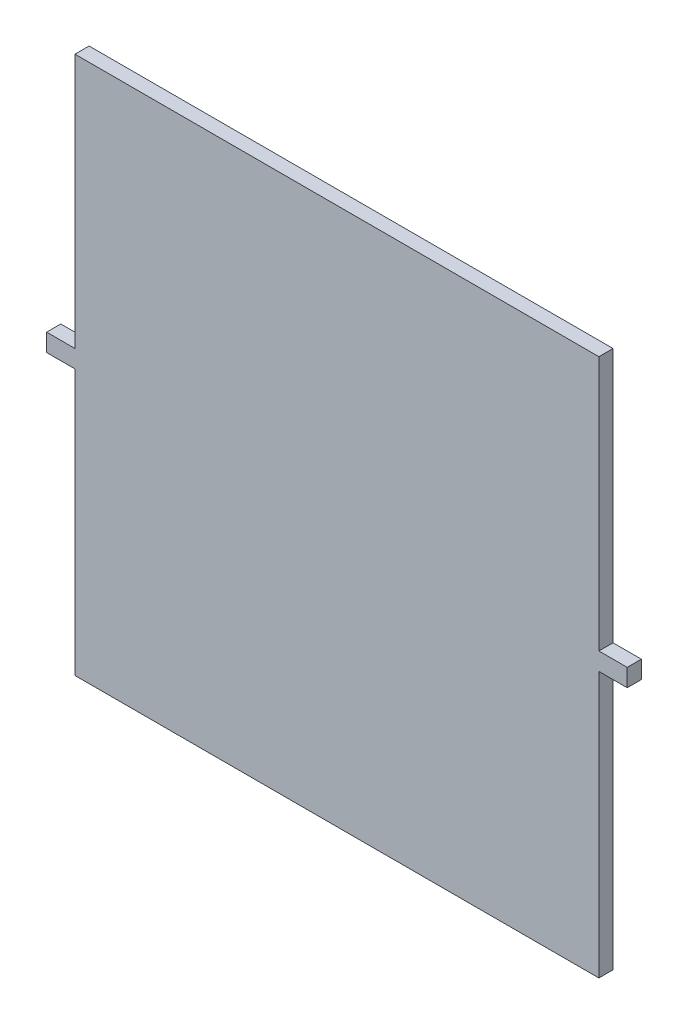
ISO-10303-21;
HEADER;
FILE_DESCRIPTION(('STEP AP214'),'2;1');
FILE_NAME('part.step','',(''),(''),'','','');
FILE_SCHEMA(('AUTOMOTIVE_DESIGN { 1 0 10303 214 1 1 1 1 }'));
ENDSEC;
DATA;
#1=APPLICATION_CONTEXT('core data for automotive mechanical design processes');
#2=APPLICATION_PROTOCOL_DEFINITION('international standard','automotive_design',2000,#1);
#3=PRODUCT_CONTEXT('',#1,'mechanical');
#4=PRODUCT('Part','Part','',(#3));
#5=PRODUCT_RELATED_PRODUCT_CATEGORY('part','',(#4));
#6=PRODUCT_DEFINITION_FORMATION('','',#4);
#7=PRODUCT_DEFINITION_CONTEXT('part definition',#1,'design');
#8=PRODUCT_DEFINITION('design','',#6,#7);
#9=PRODUCT_DEFINITION_SHAPE('','',#8);
#10=(LENGTH_UNIT() NAMED_UNIT(*) SI_UNIT(.MILLI.,.METRE.));
#11=(NAMED_UNIT(*) PLANE_ANGLE_UNIT() SI_UNIT($,.RADIAN.));
#12=(NAMED_UNIT(*) SI_UNIT($,.STERADIAN.) SOLID_ANGLE_UNIT());
#13=UNCERTAINTY_MEASURE_WITH_UNIT(LENGTH_MEASURE(1.E-05),#10,'distance_accuracy_value','');
#14=(GEOMETRIC_REPRESENTATION_CONTEXT(3) GLOBAL_UNCERTAINTY_ASSIGNED_CONTEXT((#13)) GLOBAL_UNIT_ASSIGNED_CONTEXT((#10,
#11,#12)) REPRESENTATION_CONTEXT('',''));
#15=CARTESIAN_POINT('',(0.,0.,0.));
#16=DIRECTION('',(0.,0.,1.));
#17=DIRECTION('',(1.,0.,0.));
#18=AXIS2_PLACEMENT_3D('',#15,#16,#17);
#19=CARTESIAN_POINT('',(0.,0.,4.));
#20=DIRECTION('',(-1.,0.,0.));
#21=DIRECTION('',(0.,0.,1.));
#22=AXIS2_PLACEMENT_3D('',#19,#20,#21);
#23=PLANE('',#22);
#24=DIRECTION('',(0.,1.,0.));
#25=VECTOR('',#24,1.);
#26=CARTESIAN_POINT('',(0.,0.,0.));
#27=LINE('',#26,#25);
#28=CARTESIAN_POINT('',(0.,80.,0.));
#29=VERTEX_POINT('',#28);
#30=CARTESIAN_POINT('',(0.,152.,0.));
#31=VERTEX_POINT('',#30);
#32=EDGE_CURVE('E156',#29,#31,#27,.T.);
#33=ORIENTED_EDGE('',*,*,#32,.F.);
#34=DIRECTION('',(0.,0.,-1.));
#35=VECTOR('',#34,1.);
#36=CARTESIAN_POINT('',(0.,80.,4.));
#37=LINE('',#36,#35);
#38=CARTESIAN_POINT('',(0.,80.,4.));
#39=VERTEX_POINT('',#38);
#40=EDGE_CURVE('E11',#39,#29,#37,.T.);
#41=ORIENTED_EDGE('',*,*,#40,.F.);
#42=DIRECTION('',(0.,1.,0.));
#43=VECTOR('',#42,1.);
#44=CARTESIAN_POINT('',(0.,0.,4.));
#45=LINE('',#44,#43);
#46=CARTESIAN_POINT('',(0.,152.,4.));
#47=VERTEX_POINT('',#46);
#48=EDGE_CURVE('E185',#39,#47,#45,.T.);
#49=ORIENTED_EDGE('',*,*,#48,.T.);
#50=DIRECTION('',(0.,0.,-1.));
#51=VECTOR('',#50,1.);
#52=CARTESIAN_POINT('',(0.,152.,4.));
#53=LINE('',#52,#51);
#54=EDGE_CURVE('E53',#47,#31,#53,.T.);
#55=ORIENTED_EDGE('',*,*,#54,.T.);
#56=EDGE_LOOP('',(#33,#41,#49,#55));
#57=FACE_BOUND('',#56,.T.);
#58=ADVANCED_FACE('F37',(#57),#23,.T.);
#59=CARTESIAN_POINT('',(1.38777878078145E-13,80.,4.));
#60=DIRECTION('',(0.,-1.,0.));
#61=DIRECTION('',(1.,0.,0.));
#62=AXIS2_PLACEMENT_3D('',#59,#60,#61);
#63=PLANE('',#62);
#64=DIRECTION('',(-1.,0.,0.));
#65=VECTOR('',#64,1.);
#66=CARTESIAN_POINT('',(1.38777878078145E-13,80.,0.));
#67=LINE('',#66,#65);
#68=CARTESIAN_POINT('',(-8.,80.,0.));
#69=VERTEX_POINT('',#68);
#70=EDGE_CURVE('E158',#29,#69,#67,.T.);
#71=ORIENTED_EDGE('',*,*,#70,.T.);
#72=DIRECTION('',(0.,0.,-1.));
#73=VECTOR('',#72,1.);
#74=CARTESIAN_POINT('',(-8.,80.,4.));
#75=LINE('',#74,#73);
#76=CARTESIAN_POINT('',(-8.,80.,4.));
#77=VERTEX_POINT('',#76);
#78=EDGE_CURVE('E45',#77,#69,#75,.T.);
#79=ORIENTED_EDGE('',*,*,#78,.F.);
#80=DIRECTION('',(-1.,0.,0.));
#81=VECTOR('',#80,1.);
#82=CARTESIAN_POINT('',(1.38777878078145E-13,80.,4.));
#83=LINE('',#82,#81);
#84=EDGE_CURVE('E228',#39,#77,#83,.T.);
#85=ORIENTED_EDGE('',*,*,#84,.F.);
#86=ORIENTED_EDGE('',*,*,#40,.T.);
#87=EDGE_LOOP('',(#71,#79,#85,#86));
#88=FACE_BOUND('',#87,.T.);
#89=ADVANCED_FACE('F255',(#88),#63,.F.);
#90=CARTESIAN_POINT('',(-8.,0.,4.));
#91=DIRECTION('',(1.,0.,0.));
#92=DIRECTION('',(0.,0.,-1.));
#93=AXIS2_PLACEMENT_3D('',#90,#91,#92);
#94=PLANE('',#93);
#95=DIRECTION('',(0.,-1.,0.));
#96=VECTOR('',#95,1.);
#97=CARTESIAN_POINT('',(-8.,0.,0.));
#98=LINE('',#97,#96);
#99=CARTESIAN_POINT('',(-8.,75.,0.));
#100=VERTEX_POINT('',#99);
#101=EDGE_CURVE('E160',#69,#100,#98,.T.);
#102=ORIENTED_EDGE('',*,*,#101,.T.);
#103=DIRECTION('',(0.,0.,-1.));
#104=VECTOR('',#103,1.);
#105=CARTESIAN_POINT('',(-8.,75.,4.));
#106=LINE('',#105,#104);
#107=CARTESIAN_POINT('',(-8.,75.,4.));
#108=VERTEX_POINT('',#107);
#109=EDGE_CURVE('E201',#108,#100,#106,.T.);
#110=ORIENTED_EDGE('',*,*,#109,.F.);
#111=DIRECTION('',(0.,-1.,0.));
#112=VECTOR('',#111,1.);
#113=CARTESIAN_POINT('',(-8.,0.,4.));
#114=LINE('',#113,#112);
#115=EDGE_CURVE('E209',#77,#108,#114,.T.);
#116=ORIENTED_EDGE('',*,*,#115,.F.);
#117=ORIENTED_EDGE('',*,*,#78,.T.);
#118=EDGE_LOOP('',(#102,#110,#116,#117));
#119=FACE_BOUND('',#118,.T.);
#120=ADVANCED_FACE('F207',(#119),#94,.F.);
#121=CARTESIAN_POINT('',(0.,75.,4.));
#122=DIRECTION('',(0.,-1.,0.));
#123=DIRECTION('',(0.,0.,-1.));
#124=AXIS2_PLACEMENT_3D('',#121,#122,#123);
#125=PLANE('',#124);
#126=DIRECTION('',(-1.,0.,0.));
#127=VECTOR('',#126,1.);
#128=CARTESIAN_POINT('',(0.,75.,0.));
#129=LINE('',#128,#127);
#130=CARTESIAN_POINT('',(0.,75.,0.));
#131=VERTEX_POINT('',#130);
#132=EDGE_CURVE('E163',#131,#100,#129,.T.);
#133=ORIENTED_EDGE('',*,*,#132,.F.);
#134=DIRECTION('',(0.,0.,-1.));
#135=VECTOR('',#134,1.);
#136=CARTESIAN_POINT('',(0.,75.,4.));
#137=LINE('',#136,#135);
#138=CARTESIAN_POINT('',(0.,75.,4.));
#139=VERTEX_POINT('',#138);
#140=EDGE_CURVE('E199',#139,#131,#137,.T.);
#141=ORIENTED_EDGE('',*,*,#140,.F.);
#142=DIRECTION('',(-1.,0.,0.));
#143=VECTOR('',#142,1.);
#144=CARTESIAN_POINT('',(0.,75.,4.));
#145=LINE('',#144,#143);
#146=EDGE_CURVE('E221',#139,#108,#145,.T.);
#147=ORIENTED_EDGE('',*,*,#146,.T.);
#148=ORIENTED_EDGE('',*,*,#109,.T.);
#149=EDGE_LOOP('',(#133,#141,#147,#148));
#150=FACE_BOUND('',#149,.T.);
#151=ADVANCED_FACE('F218',(#150),#125,.T.);
#152=CARTESIAN_POINT('',(0.,0.,4.));
#153=DIRECTION('',(-1.,0.,0.));
#154=DIRECTION('',(0.,0.,1.));
#155=AXIS2_PLACEMENT_3D('',#152,#153,#154);
#156=PLANE('',#155);
#157=DIRECTION('',(0.,1.,0.));
#158=VECTOR('',#157,1.);
#159=CARTESIAN_POINT('',(0.,0.,0.));
#160=LINE('',#159,#158);
#161=CARTESIAN_POINT('',(0.,0.,0.));
#162=VERTEX_POINT('',#161);
#163=EDGE_CURVE('E166',#162,#131,#160,.T.);
#164=ORIENTED_EDGE('',*,*,#163,.F.);
#165=DIRECTION('',(0.,0.,-1.));
#166=VECTOR('',#165,1.);
#167=CARTESIAN_POINT('',(0.,0.,4.));
#168=LINE('',#167,#166);
#169=CARTESIAN_POINT('',(0.,0.,4.));
#170=VERTEX_POINT('',#169);
#171=EDGE_CURVE('E197',#170,#162,#168,.T.);
#172=ORIENTED_EDGE('',*,*,#171,.F.);
#173=DIRECTION('',(0.,1.,0.));
#174=VECTOR('',#173,1.);
#175=CARTESIAN_POINT('',(0.,0.,4.));
#176=LINE('',#175,#174);
#177=EDGE_CURVE('E224',#170,#139,#176,.T.);
#178=ORIENTED_EDGE('',*,*,#177,.T.);
#179=ORIENTED_EDGE('',*,*,#140,.T.);
#180=EDGE_LOOP('',(#164,#172,#178,#179));
#181=FACE_BOUND('',#180,.T.);
#182=ADVANCED_FACE('F266',(#181),#156,.T.);
#183=CARTESIAN_POINT('',(0.,0.,4.));
#184=DIRECTION('',(0.,1.,0.));
#185=DIRECTION('',(0.,0.,1.));
#186=AXIS2_PLACEMENT_3D('',#183,#184,#185);
#187=PLANE('',#186);
#188=DIRECTION('',(1.,0.,0.));
#189=VECTOR('',#188,1.);
#190=CARTESIAN_POINT('',(0.,0.,0.));
#191=LINE('',#190,#189);
#192=CARTESIAN_POINT('',(148.,0.,0.));
#193=VERTEX_POINT('',#192);
#194=EDGE_CURVE('E169',#162,#193,#191,.T.);
#195=ORIENTED_EDGE('',*,*,#194,.T.);
#196=DIRECTION('',(0.,0.,-1.));
#197=VECTOR('',#196,1.);
#198=CARTESIAN_POINT('',(148.,0.,4.));
#199=LINE('',#198,#197);
#200=CARTESIAN_POINT('',(148.,0.,4.));
#201=VERTEX_POINT('',#200);
#202=EDGE_CURVE('E194',#201,#193,#199,.T.);
#203=ORIENTED_EDGE('',*,*,#202,.F.);
#204=DIRECTION('',(1.,0.,0.));
#205=VECTOR('',#204,1.);
#206=CARTESIAN_POINT('',(0.,0.,4.));
#207=LINE('',#206,#205);
#208=EDGE_CURVE('E226',#170,#201,#207,.T.);
#209=ORIENTED_EDGE('',*,*,#208,.F.);
#210=ORIENTED_EDGE('',*,*,#171,.T.);
#211=EDGE_LOOP('',(#195,#203,#209,#210));
#212=FACE_BOUND('',#211,.T.);
#213=ADVANCED_FACE('F269',(#212),#187,.F.);
#214=CARTESIAN_POINT('',(148.,0.,4.));
#215=DIRECTION('',(-1.,0.,0.));
#216=DIRECTION('',(0.,0.,1.));
#217=AXIS2_PLACEMENT_3D('',#214,#215,#216);
#218=PLANE('',#217);
#219=DIRECTION('',(0.,1.,0.));
#220=VECTOR('',#219,1.);
#221=CARTESIAN_POINT('',(148.,0.,0.));
#222=LINE('',#221,#220);
#223=CARTESIAN_POINT('',(148.,75.,0.));
#224=VERTEX_POINT('',#223);
#225=EDGE_CURVE('E171',#193,#224,#222,.T.);
#226=ORIENTED_EDGE('',*,*,#225,.T.);
#227=DIRECTION('',(0.,0.,-1.));
#228=VECTOR('',#227,1.);
#229=CARTESIAN_POINT('',(148.,75.,4.));
#230=LINE('',#229,#228);
#231=CARTESIAN_POINT('',(148.,75.,4.));
#232=VERTEX_POINT('',#231);
#233=EDGE_CURVE('E191',#232,#224,#230,.T.);
#234=ORIENTED_EDGE('',*,*,#233,.F.);
#235=DIRECTION('',(0.,1.,0.));
#236=VECTOR('',#235,1.);
#237=CARTESIAN_POINT('',(148.,0.,4.));
#238=LINE('',#237,#236);
#239=EDGE_CURVE('E233',#201,#232,#238,.T.);
#240=ORIENTED_EDGE('',*,*,#239,.F.);
#241=ORIENTED_EDGE('',*,*,#202,.T.);
#242=EDGE_LOOP('',(#226,#234,#240,#241));
#243=FACE_BOUND('',#242,.T.);
#244=ADVANCED_FACE('F273',(#243),#218,.F.);
#245=CARTESIAN_POINT('',(0.,75.,4.));
#246=DIRECTION('',(0.,1.,0.));
#247=DIRECTION('',(0.,0.,1.));
#248=AXIS2_PLACEMENT_3D('',#245,#246,#247);
#249=PLANE('',#248);
#250=DIRECTION('',(1.,0.,0.));
#251=VECTOR('',#250,1.);
#252=CARTESIAN_POINT('',(0.,75.,0.));
#253=LINE('',#252,#251);
#254=CARTESIAN_POINT('',(156.,75.,0.));
#255=VERTEX_POINT('',#254);
#256=EDGE_CURVE('E173',#224,#255,#253,.T.);
#257=ORIENTED_EDGE('',*,*,#256,.T.);
#258=DIRECTION('',(0.,0.,-1.));
#259=VECTOR('',#258,1.);
#260=CARTESIAN_POINT('',(156.,75.,4.));
#261=LINE('',#260,#259);
#262=CARTESIAN_POINT('',(156.,75.,4.));
#263=VERTEX_POINT('',#262);
#264=EDGE_CURVE('E189',#263,#255,#261,.T.);
#265=ORIENTED_EDGE('',*,*,#264,.F.);
#266=DIRECTION('',(1.,0.,0.));
#267=VECTOR('',#266,1.);
#268=CARTESIAN_POINT('',(0.,75.,4.));
#269=LINE('',#268,#267);
#270=EDGE_CURVE('E151',#232,#263,#269,.T.);
#271=ORIENTED_EDGE('',*,*,#270,.F.);
#272=ORIENTED_EDGE('',*,*,#233,.T.);
#273=EDGE_LOOP('',(#257,#265,#271,#272));
#274=FACE_BOUND('',#273,.T.);
#275=ADVANCED_FACE('F239',(#274),#249,.F.);
#276=CARTESIAN_POINT('',(156.,0.,4.));
#277=DIRECTION('',(1.,0.,0.));
#278=DIRECTION('',(0.,0.,-1.));
#279=AXIS2_PLACEMENT_3D('',#276,#277,#278);
#280=PLANE('',#279);
#281=DIRECTION('',(0.,-1.,0.));
#282=VECTOR('',#281,1.);
#283=CARTESIAN_POINT('',(156.,0.,0.));
#284=LINE('',#283,#282);
#285=CARTESIAN_POINT('',(156.,80.,0.));
#286=VERTEX_POINT('',#285);
#287=EDGE_CURVE('E176',#286,#255,#284,.T.);
#288=ORIENTED_EDGE('',*,*,#287,.F.);
#289=DIRECTION('',(0.,0.,-1.));
#290=VECTOR('',#289,1.);
#291=CARTESIAN_POINT('',(156.,80.,4.));
#292=LINE('',#291,#290);
#293=CARTESIAN_POINT('',(156.,80.,4.));
#294=VERTEX_POINT('',#293);
#295=EDGE_CURVE('E137',#294,#286,#292,.T.);
#296=ORIENTED_EDGE('',*,*,#295,.F.);
#297=DIRECTION('',(0.,-1.,0.));
#298=VECTOR('',#297,1.);
#299=CARTESIAN_POINT('',(156.,0.,4.));
#300=LINE('',#299,#298);
#301=EDGE_CURVE('E149',#294,#263,#300,.T.);
#302=ORIENTED_EDGE('',*,*,#301,.T.);
#303=ORIENTED_EDGE('',*,*,#264,.T.);
#304=EDGE_LOOP('',(#288,#296,#302,#303));
#305=FACE_BOUND('',#304,.T.);
#306=ADVANCED_FACE('F243',(#305),#280,.T.);
#307=CARTESIAN_POINT('',(1.38777878078145E-13,80.0000000000003,4.));
#308=DIRECTION('',(0.,1.,0.));
#309=DIRECTION('',(-1.,0.,0.));
#310=AXIS2_PLACEMENT_3D('',#307,#308,#309);
#311=PLANE('',#310);
#312=DIRECTION('',(1.,0.,0.));
#313=VECTOR('',#312,1.);
#314=CARTESIAN_POINT('',(1.38777878078145E-13,80.0000000000003,0.));
#315=LINE('',#314,#313);
#316=CARTESIAN_POINT('',(148.,80.,0.));
#317=VERTEX_POINT('',#316);
#318=EDGE_CURVE('E134',#317,#286,#315,.T.);
#319=ORIENTED_EDGE('',*,*,#318,.F.);
#320=DIRECTION('',(0.,0.,-1.));
#321=VECTOR('',#320,1.);
#322=CARTESIAN_POINT('',(148.,80.,4.));
#323=LINE('',#322,#321);
#324=CARTESIAN_POINT('',(148.,80.,4.));
#325=VERTEX_POINT('',#324);
#326=EDGE_CURVE('E128',#325,#317,#323,.T.);
#327=ORIENTED_EDGE('',*,*,#326,.F.);
#328=DIRECTION('',(1.,0.,0.));
#329=VECTOR('',#328,1.);
#330=CARTESIAN_POINT('',(1.38777878078145E-13,80.0000000000003,4.));
#331=LINE('',#330,#329);
#332=EDGE_CURVE('E132',#325,#294,#331,.T.);
#333=ORIENTED_EDGE('',*,*,#332,.T.);
#334=ORIENTED_EDGE('',*,*,#295,.T.);
#335=EDGE_LOOP('',(#319,#327,#333,#334));
#336=FACE_BOUND('',#335,.T.);
#337=ADVANCED_FACE('F130',(#336),#311,.T.);
#338=CARTESIAN_POINT('',(148.,0.,4.));
#339=DIRECTION('',(-1.,0.,0.));
#340=DIRECTION('',(0.,0.,1.));
#341=AXIS2_PLACEMENT_3D('',#338,#339,#340);
#342=PLANE('',#341);
#343=DIRECTION('',(0.,1.,0.));
#344=VECTOR('',#343,1.);
#345=CARTESIAN_POINT('',(148.,0.,0.));
#346=LINE('',#345,#344);
#347=CARTESIAN_POINT('',(148.,152.,0.));
#348=VERTEX_POINT('',#347);
#349=EDGE_CURVE('E180',#317,#348,#346,.T.);
#350=ORIENTED_EDGE('',*,*,#349,.T.);
#351=DIRECTION('',(0.,0.,-1.));
#352=VECTOR('',#351,1.);
#353=CARTESIAN_POINT('',(148.,152.,4.));
#354=LINE('',#353,#352);
#355=CARTESIAN_POINT('',(148.,152.,4.));
#356=VERTEX_POINT('',#355);
#357=EDGE_CURVE('E91',#356,#348,#354,.T.);
#358=ORIENTED_EDGE('',*,*,#357,.F.);
#359=DIRECTION('',(0.,1.,0.));
#360=VECTOR('',#359,1.);
#361=CARTESIAN_POINT('',(148.,0.,4.));
#362=LINE('',#361,#360);
#363=EDGE_CURVE('E139',#325,#356,#362,.T.);
#364=ORIENTED_EDGE('',*,*,#363,.F.);
#365=ORIENTED_EDGE('',*,*,#326,.T.);
#366=EDGE_LOOP('',(#350,#358,#364,#365));
#367=FACE_BOUND('',#366,.T.);
#368=ADVANCED_FACE('F140',(#367),#342,.F.);
#369=CARTESIAN_POINT('',(0.,152.,4.));
#370=DIRECTION('',(0.,1.,0.));
#371=DIRECTION('',(0.,0.,1.));
#372=AXIS2_PLACEMENT_3D('',#369,#370,#371);
#373=PLANE('',#372);
#374=DIRECTION('',(1.,0.,0.));
#375=VECTOR('',#374,1.);
#376=CARTESIAN_POINT('',(0.,152.,0.));
#377=LINE('',#376,#375);
#378=EDGE_CURVE('E182',#31,#348,#377,.T.);
#379=ORIENTED_EDGE('',*,*,#378,.F.);
#380=ORIENTED_EDGE('',*,*,#54,.F.);
#381=DIRECTION('',(1.,0.,0.));
#382=VECTOR('',#381,1.);
#383=CARTESIAN_POINT('',(0.,152.,4.));
#384=LINE('',#383,#382);
#385=EDGE_CURVE('E143',#47,#356,#384,.T.);
#386=ORIENTED_EDGE('',*,*,#385,.T.);
#387=ORIENTED_EDGE('',*,*,#357,.T.);
#388=EDGE_LOOP('',(#379,#380,#386,#387));
#389=FACE_BOUND('',#388,.T.);
#390=ADVANCED_FACE('F244',(#389),#373,.T.);
#391=CARTESIAN_POINT('',(0.,0.,4.));
#392=DIRECTION('',(0.,0.,1.));
#393=DIRECTION('',(1.,0.,0.));
#394=AXIS2_PLACEMENT_3D('',#391,#392,#393);
#395=PLANE('',#394);
#396=ORIENTED_EDGE('',*,*,#48,.F.);
#397=ORIENTED_EDGE('',*,*,#84,.T.);
#398=ORIENTED_EDGE('',*,*,#115,.T.);
#399=ORIENTED_EDGE('',*,*,#146,.F.);
#400=ORIENTED_EDGE('',*,*,#177,.F.);
#401=ORIENTED_EDGE('',*,*,#208,.T.);
#402=ORIENTED_EDGE('',*,*,#239,.T.);
#403=ORIENTED_EDGE('',*,*,#270,.T.);
#404=ORIENTED_EDGE('',*,*,#301,.F.);
#405=ORIENTED_EDGE('',*,*,#332,.F.);
#406=ORIENTED_EDGE('',*,*,#363,.T.);
#407=ORIENTED_EDGE('',*,*,#385,.F.);
#408=EDGE_LOOP('',(#396,#397,#398,#399,#400,#401,#402,#403,#404,#405,#406,#407));
#409=FACE_BOUND('',#408,.T.);
#410=ADVANCED_FACE('F147',(#409),#395,.T.);
#411=CARTESIAN_POINT('',(0.,0.,0.));
#412=DIRECTION('',(0.,0.,1.));
#413=DIRECTION('',(1.,0.,0.));
#414=AXIS2_PLACEMENT_3D('',#411,#412,#413);
#415=PLANE('',#414);
#416=ORIENTED_EDGE('',*,*,#32,.T.);
#417=ORIENTED_EDGE('',*,*,#378,.T.);
#418=ORIENTED_EDGE('',*,*,#349,.F.);
#419=ORIENTED_EDGE('',*,*,#318,.T.);
#420=ORIENTED_EDGE('',*,*,#287,.T.);
#421=ORIENTED_EDGE('',*,*,#256,.F.);
#422=ORIENTED_EDGE('',*,*,#225,.F.);
#423=ORIENTED_EDGE('',*,*,#194,.F.);
#424=ORIENTED_EDGE('',*,*,#163,.T.);
#425=ORIENTED_EDGE('',*,*,#132,.T.);
#426=ORIENTED_EDGE('',*,*,#101,.F.);
#427=ORIENTED_EDGE('',*,*,#70,.F.);
#428=EDGE_LOOP('',(#416,#417,#418,#419,#420,#421,#422,#423,#424,#425,#426,#427));
#429=FACE_BOUND('',#428,.T.);
#430=ADVANCED_FACE('F213',(#429),#415,.F.);
#431=CLOSED_SHELL('',(#58,#89,#120,#151,#182,#213,#244,#275,#306,#337,#368,#390,#410,#430));
#432=MANIFOLD_SOLID_BREP('B2',#431);
#433=ADVANCED_BREP_SHAPE_REPRESENTATION('',(#18,#432),#14);
#434=SHAPE_DEFINITION_REPRESENTATION(#9,#433);
ENDSEC;
END-ISO-10303-21;
